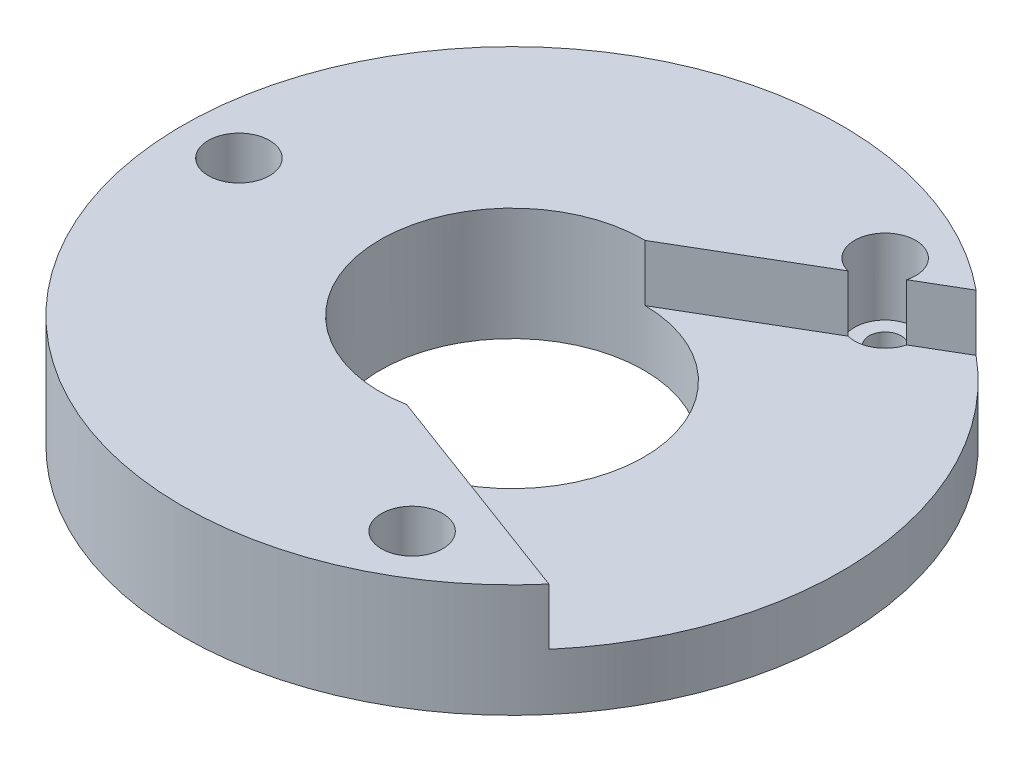
ISO-10303-21;
HEADER;
FILE_DESCRIPTION(('STEP AP214'),'2;1');
FILE_NAME('part.step','',(''),(''),'','','');
FILE_SCHEMA(('AUTOMOTIVE_DESIGN { 1 0 10303 214 1 1 1 1 }'));
ENDSEC;
DATA;
#1=APPLICATION_CONTEXT('core data for automotive mechanical design processes');
#2=APPLICATION_PROTOCOL_DEFINITION('international standard','automotive_design',2000,#1);
#3=PRODUCT_CONTEXT('',#1,'mechanical');
#4=PRODUCT('Part','Part','',(#3));
#5=PRODUCT_RELATED_PRODUCT_CATEGORY('part','',(#4));
#6=PRODUCT_DEFINITION_FORMATION('','',#4);
#7=PRODUCT_DEFINITION_CONTEXT('part definition',#1,'design');
#8=PRODUCT_DEFINITION('design','',#6,#7);
#9=PRODUCT_DEFINITION_SHAPE('','',#8);
#10=(LENGTH_UNIT() NAMED_UNIT(*) SI_UNIT(.MILLI.,.METRE.));
#11=(NAMED_UNIT(*) PLANE_ANGLE_UNIT() SI_UNIT($,.RADIAN.));
#12=(NAMED_UNIT(*) SI_UNIT($,.STERADIAN.) SOLID_ANGLE_UNIT());
#13=UNCERTAINTY_MEASURE_WITH_UNIT(LENGTH_MEASURE(1.E-05),#10,'distance_accuracy_value','');
#14=(GEOMETRIC_REPRESENTATION_CONTEXT(3) GLOBAL_UNCERTAINTY_ASSIGNED_CONTEXT((#13)) GLOBAL_UNIT_ASSIGNED_CONTEXT((#10,
#11,#12)) REPRESENTATION_CONTEXT('',''));
#15=CARTESIAN_POINT('',(0.,0.,0.));
#16=DIRECTION('',(0.,0.,1.));
#17=DIRECTION('',(1.,0.,0.));
#18=AXIS2_PLACEMENT_3D('',#15,#16,#17);
#19=CARTESIAN_POINT('',(14.5,12.,-25.1147367097487));
#20=DIRECTION('',(0.,-1.,0.));
#21=DIRECTION('',(0.,0.,-1.));
#22=AXIS2_PLACEMENT_3D('',#19,#20,#21);
#23=CYLINDRICAL_SURFACE('',#22,1.7);
#24=CARTESIAN_POINT('',(14.5,0.,-25.1147367097487));
#25=DIRECTION('',(0.,1.,0.));
#26=DIRECTION('',(0.,0.,1.));
#27=AXIS2_PLACEMENT_3D('',#24,#25,#26);
#28=CIRCLE('',#27,1.7);
#29=CARTESIAN_POINT('',(14.5,0.,-23.4147367097487));
#30=VERTEX_POINT('',#29);
#31=EDGE_CURVE('E146',#30,#30,#28,.T.);
#32=ORIENTED_EDGE('',*,*,#31,.F.);
#33=EDGE_LOOP('',(#32));
#34=FACE_BOUND('',#33,.T.);
#35=CARTESIAN_POINT('',(14.5,4.,-25.1147367097487));
#36=DIRECTION('',(0.,1.,0.));
#37=DIRECTION('',(0.,0.,1.));
#38=AXIS2_PLACEMENT_3D('',#35,#36,#37);
#39=CIRCLE('',#38,1.7);
#40=CARTESIAN_POINT('',(14.5,4.,-23.4147367097487));
#41=VERTEX_POINT('',#40);
#42=EDGE_CURVE('E53',#41,#41,#39,.T.);
#43=ORIENTED_EDGE('',*,*,#42,.T.);
#44=EDGE_LOOP('',(#43));
#45=FACE_BOUND('',#44,.T.);
#46=ADVANCED_FACE('F49',(#34,#45),#23,.F.);
#47=CARTESIAN_POINT('',(14.5,12.,25.1147367097487));
#48=DIRECTION('',(0.,-1.,0.));
#49=DIRECTION('',(0.,0.,-1.));
#50=AXIS2_PLACEMENT_3D('',#47,#48,#49);
#51=CYLINDRICAL_SURFACE('',#50,1.7);
#52=CARTESIAN_POINT('',(14.5,0.,25.1147367097487));
#53=DIRECTION('',(0.,1.,0.));
#54=DIRECTION('',(0.,0.,1.));
#55=AXIS2_PLACEMENT_3D('',#52,#53,#54);
#56=CIRCLE('',#55,1.7);
#57=CARTESIAN_POINT('',(14.5,0.,26.8147367097487));
#58=VERTEX_POINT('',#57);
#59=EDGE_CURVE('E143',#58,#58,#56,.T.);
#60=ORIENTED_EDGE('',*,*,#59,.F.);
#61=EDGE_LOOP('',(#60));
#62=FACE_BOUND('',#61,.T.);
#63=CARTESIAN_POINT('',(14.5,4.,25.1147367097487));
#64=DIRECTION('',(0.,1.,0.));
#65=DIRECTION('',(0.,0.,1.));
#66=AXIS2_PLACEMENT_3D('',#63,#64,#65);
#67=CIRCLE('',#66,1.7);
#68=CARTESIAN_POINT('',(14.5,4.,26.8147367097487));
#69=VERTEX_POINT('',#68);
#70=EDGE_CURVE('E156',#69,#69,#67,.T.);
#71=ORIENTED_EDGE('',*,*,#70,.T.);
#72=EDGE_LOOP('',(#71));
#73=FACE_BOUND('',#72,.T.);
#74=ADVANCED_FACE('F203',(#62,#73),#51,.F.);
#75=CARTESIAN_POINT('',(-29.,12.,0.));
#76=DIRECTION('',(0.,-1.,0.));
#77=DIRECTION('',(0.,0.,-1.));
#78=AXIS2_PLACEMENT_3D('',#75,#76,#77);
#79=CYLINDRICAL_SURFACE('',#78,1.7);
#80=CARTESIAN_POINT('',(-29.,0.,0.));
#81=DIRECTION('',(0.,1.,0.));
#82=DIRECTION('',(0.,0.,1.));
#83=AXIS2_PLACEMENT_3D('',#80,#81,#82);
#84=CIRCLE('',#83,1.7);
#85=CARTESIAN_POINT('',(-29.,0.,1.69999999999998));
#86=VERTEX_POINT('',#85);
#87=EDGE_CURVE('E136',#86,#86,#84,.T.);
#88=ORIENTED_EDGE('',*,*,#87,.F.);
#89=EDGE_LOOP('',(#88));
#90=FACE_BOUND('',#89,.T.);
#91=CARTESIAN_POINT('',(-29.,4.,0.));
#92=DIRECTION('',(0.,1.,0.));
#93=DIRECTION('',(0.,0.,1.));
#94=AXIS2_PLACEMENT_3D('',#91,#92,#93);
#95=CIRCLE('',#94,1.7);
#96=CARTESIAN_POINT('',(-29.,4.,1.69999999999998));
#97=VERTEX_POINT('',#96);
#98=EDGE_CURVE('E109',#97,#97,#95,.T.);
#99=ORIENTED_EDGE('',*,*,#98,.T.);
#100=EDGE_LOOP('',(#99));
#101=FACE_BOUND('',#100,.T.);
#102=ADVANCED_FACE('F209',(#90,#101),#79,.F.);
#103=CARTESIAN_POINT('',(-6.07447058478018,6.,-10.3489519814636));
#104=DIRECTION('',(0.506205882065015,0.,0.86241266512197));
#105=DIRECTION('',(0.862412665121971,0.,-0.506205882065015));
#106=AXIS2_PLACEMENT_3D('',#103,#104,#105);
#107=PLANE('',#106);
#108=DIRECTION('',(0.,1.,0.));
#109=VECTOR('',#108,1.);
#110=CARTESIAN_POINT('',(17.6375021066938,4.,-24.2670454154133));
#111=LINE('',#110,#109);
#112=CARTESIAN_POINT('',(17.6375021066938,6.,-24.2670454154133));
#113=VERTEX_POINT('',#112);
#114=CARTESIAN_POINT('',(17.6375021066938,12.,-24.2670454154133));
#115=VERTEX_POINT('',#114);
#116=EDGE_CURVE('E101',#113,#115,#111,.T.);
#117=ORIENTED_EDGE('',*,*,#116,.F.);
#118=DIRECTION('',(0.862412665121971,0.,-0.506205882065015));
#119=VECTOR('',#118,1.);
#120=CARTESIAN_POINT('',(-6.07447058478018,6.,-10.3489519814636));
#121=LINE('',#120,#119);
#122=CARTESIAN_POINT('',(22.2804198040886,6.,-26.9922746976533));
#123=VERTEX_POINT('',#122);
#124=EDGE_CURVE('E176',#113,#123,#121,.T.);
#125=ORIENTED_EDGE('',*,*,#124,.T.);
#126=DIRECTION('',(0.,1.,0.));
#127=VECTOR('',#126,1.);
#128=CARTESIAN_POINT('',(22.2804198040886,6.,-26.9922746976533));
#129=LINE('',#128,#127);
#130=CARTESIAN_POINT('',(22.2804198040886,12.,-26.9922746976533));
#131=VERTEX_POINT('',#130);
#132=EDGE_CURVE('E126',#123,#131,#129,.T.);
#133=ORIENTED_EDGE('',*,*,#132,.T.);
#134=DIRECTION('',(0.862412665121971,0.,-0.506205882065015));
#135=VECTOR('',#134,1.);
#136=CARTESIAN_POINT('',(-6.07447058478018,12.,-10.3489519814636));
#137=LINE('',#136,#135);
#138=EDGE_CURVE('E116',#115,#131,#137,.T.);
#139=ORIENTED_EDGE('',*,*,#138,.F.);
#140=EDGE_LOOP('',(#117,#125,#133,#139));
#141=FACE_BOUND('',#140,.T.);
#142=ADVANCED_FACE('F124',(#141),#107,.T.);
#143=CARTESIAN_POINT('',(0.,12.,0.));
#144=DIRECTION('',(0.,1.,0.));
#145=DIRECTION('',(0.,0.,1.));
#146=AXIS2_PLACEMENT_3D('',#143,#144,#145);
#147=PLANE('',#146);
#148=CARTESIAN_POINT('',(14.5,12.,-25.1147367097487));
#149=DIRECTION('',(0.,1.,0.));
#150=DIRECTION('',(0.,0.,1.));
#151=AXIS2_PLACEMENT_3D('',#148,#149,#150);
#152=CIRCLE('',#151,3.25);
#153=CARTESIAN_POINT('',(13.7105660008352,12.,-21.9620721286423));
#154=VERTEX_POINT('',#153);
#155=EDGE_CURVE('E105',#115,#154,#152,.T.);
#156=ORIENTED_EDGE('',*,*,#155,.F.);
#157=ORIENTED_EDGE('',*,*,#138,.T.);
#158=CARTESIAN_POINT('',(0.,12.,0.));
#159=DIRECTION('',(0.,1.,0.));
#160=DIRECTION('',(0.,0.,1.));
#161=AXIS2_PLACEMENT_3D('',#158,#159,#160);
#162=CIRCLE('',#161,35.);
#163=CARTESIAN_POINT('',(26.6290894757659,12.,22.7132470970501));
#164=VERTEX_POINT('',#163);
#165=EDGE_CURVE('E150',#131,#164,#162,.T.);
#166=ORIENTED_EDGE('',*,*,#165,.T.);
#167=DIRECTION('',(0.937212407852909,0.,0.348759089582699));
#168=VECTOR('',#167,1.);
#169=CARTESIAN_POINT('',(-4.18510907499239,12.,11.2465488942349));
#170=LINE('',#169,#168);
#171=CARTESIAN_POINT('',(2.57322571003706,12.,13.761486454784));
#172=VERTEX_POINT('',#171);
#173=EDGE_CURVE('E128',#172,#164,#170,.T.);
#174=ORIENTED_EDGE('',*,*,#173,.F.);
#175=CARTESIAN_POINT('',(0.,12.,0.));
#176=DIRECTION('',(0.,-1.,0.));
#177=DIRECTION('',(0.,0.,-1.));
#178=AXIS2_PLACEMENT_3D('',#175,#176,#177);
#179=CIRCLE('',#178,14.);
#180=CARTESIAN_POINT('',(0.144475584633452,12.,-13.9992545089174));
#181=VERTEX_POINT('',#180);
#182=EDGE_CURVE('E165',#172,#181,#179,.T.);
#183=ORIENTED_EDGE('',*,*,#182,.T.);
#184=EDGE_CURVE('E120',#181,#154,#137,.T.);
#185=ORIENTED_EDGE('',*,*,#184,.T.);
#186=EDGE_LOOP('',(#156,#157,#166,#174,#183,#185));
#187=FACE_BOUND('',#186,.T.);
#188=CARTESIAN_POINT('',(14.5,12.,25.1147367097487));
#189=DIRECTION('',(0.,1.,0.));
#190=DIRECTION('',(0.,0.,1.));
#191=AXIS2_PLACEMENT_3D('',#188,#189,#190);
#192=CIRCLE('',#191,3.25);
#193=CARTESIAN_POINT('',(14.5,12.,28.3647367097487));
#194=VERTEX_POINT('',#193);
#195=EDGE_CURVE('E243',#194,#194,#192,.T.);
#196=ORIENTED_EDGE('',*,*,#195,.F.);
#197=EDGE_LOOP('',(#196));
#198=FACE_BOUND('',#197,.T.);
#199=CARTESIAN_POINT('',(-29.,12.,0.));
#200=DIRECTION('',(0.,1.,0.));
#201=DIRECTION('',(0.,0.,1.));
#202=AXIS2_PLACEMENT_3D('',#199,#200,#201);
#203=CIRCLE('',#202,3.25);
#204=CARTESIAN_POINT('',(-29.,12.,3.24999999999998));
#205=VERTEX_POINT('',#204);
#206=EDGE_CURVE('E244',#205,#205,#203,.T.);
#207=ORIENTED_EDGE('',*,*,#206,.F.);
#208=EDGE_LOOP('',(#207));
#209=FACE_BOUND('',#208,.T.);
#210=ADVANCED_FACE('F113',(#187,#198,#209),#147,.T.);
#211=CARTESIAN_POINT('',(0.,12.,0.));
#212=DIRECTION('',(0.,-1.,0.));
#213=DIRECTION('',(0.,0.,-1.));
#214=AXIS2_PLACEMENT_3D('',#211,#212,#213);
#215=CYLINDRICAL_SURFACE('',#214,35.);
#216=CARTESIAN_POINT('',(0.,0.,0.));
#217=DIRECTION('',(0.,1.,0.));
#218=DIRECTION('',(0.,0.,1.));
#219=AXIS2_PLACEMENT_3D('',#216,#217,#218);
#220=CIRCLE('',#219,35.);
#221=CARTESIAN_POINT('',(0.,0.,35.));
#222=VERTEX_POINT('',#221);
#223=EDGE_CURVE('E149',#222,#222,#220,.T.);
#224=ORIENTED_EDGE('',*,*,#223,.T.);
#225=EDGE_LOOP('',(#224));
#226=FACE_BOUND('',#225,.T.);
#227=ORIENTED_EDGE('',*,*,#132,.F.);
#228=CARTESIAN_POINT('',(0.,6.,0.));
#229=DIRECTION('',(0.,1.,0.));
#230=DIRECTION('',(0.,0.,1.));
#231=AXIS2_PLACEMENT_3D('',#228,#229,#230);
#232=CIRCLE('',#231,35.);
#233=CARTESIAN_POINT('',(26.6290894757659,6.,22.7132470970501));
#234=VERTEX_POINT('',#233);
#235=EDGE_CURVE('E174',#234,#123,#232,.T.);
#236=ORIENTED_EDGE('',*,*,#235,.F.);
#237=DIRECTION('',(0.,1.,0.));
#238=VECTOR('',#237,1.);
#239=CARTESIAN_POINT('',(26.6290894757659,6.,22.7132470970501));
#240=LINE('',#239,#238);
#241=EDGE_CURVE('E137',#234,#164,#240,.T.);
#242=ORIENTED_EDGE('',*,*,#241,.T.);
#243=ORIENTED_EDGE('',*,*,#165,.F.);
#244=EDGE_LOOP('',(#227,#236,#242,#243));
#245=FACE_BOUND('',#244,.T.);
#246=ADVANCED_FACE('F51',(#226,#245),#215,.T.);
#247=CARTESIAN_POINT('',(0.,0.,0.));
#248=DIRECTION('',(0.,1.,0.));
#249=DIRECTION('',(0.,0.,1.));
#250=AXIS2_PLACEMENT_3D('',#247,#248,#249);
#251=PLANE('',#250);
#252=CARTESIAN_POINT('',(0.,0.,0.));
#253=DIRECTION('',(0.,-1.,0.));
#254=DIRECTION('',(0.,0.,-1.));
#255=AXIS2_PLACEMENT_3D('',#252,#253,#254);
#256=CIRCLE('',#255,14.);
#257=CARTESIAN_POINT('',(0.,0.,-14.));
#258=VERTEX_POINT('',#257);
#259=EDGE_CURVE('E161',#258,#258,#256,.T.);
#260=ORIENTED_EDGE('',*,*,#259,.F.);
#261=EDGE_LOOP('',(#260));
#262=FACE_BOUND('',#261,.T.);
#263=ORIENTED_EDGE('',*,*,#223,.F.);
#264=EDGE_LOOP('',(#263));
#265=FACE_BOUND('',#264,.T.);
#266=ORIENTED_EDGE('',*,*,#31,.T.);
#267=EDGE_LOOP('',(#266));
#268=FACE_BOUND('',#267,.T.);
#269=ORIENTED_EDGE('',*,*,#59,.T.);
#270=EDGE_LOOP('',(#269));
#271=FACE_BOUND('',#270,.T.);
#272=ORIENTED_EDGE('',*,*,#87,.T.);
#273=EDGE_LOOP('',(#272));
#274=FACE_BOUND('',#273,.T.);
#275=ADVANCED_FACE('F199',(#262,#265,#268,#271,#274),#251,.F.);
#276=DIRECTION('',(0.,1.,0.));
#277=VECTOR('',#276,1.);
#278=CARTESIAN_POINT('',(13.7105660008352,4.,-21.9620721286423));
#279=LINE('',#278,#277);
#280=CARTESIAN_POINT('',(13.7105660008352,6.,-21.9620721286423));
#281=VERTEX_POINT('',#280);
#282=EDGE_CURVE('E65',#154,#281,#279,.F.);
#283=ORIENTED_EDGE('',*,*,#282,.F.);
#284=ORIENTED_EDGE('',*,*,#184,.F.);
#285=DIRECTION('',(0.,-1.,0.));
#286=VECTOR('',#285,1.);
#287=CARTESIAN_POINT('',(0.14447558463346,12.,-13.9992545089174));
#288=LINE('',#287,#286);
#289=CARTESIAN_POINT('',(0.144475584633452,6.,-13.9992545089174));
#290=VERTEX_POINT('',#289);
#291=EDGE_CURVE('E131',#290,#181,#288,.F.);
#292=ORIENTED_EDGE('',*,*,#291,.F.);
#293=EDGE_CURVE('E140',#290,#281,#121,.T.);
#294=ORIENTED_EDGE('',*,*,#293,.T.);
#295=EDGE_LOOP('',(#283,#284,#292,#294));
#296=FACE_BOUND('',#295,.T.);
#297=ADVANCED_FACE('F191',(#296),#107,.T.);
#298=CARTESIAN_POINT('',(-4.18510907499239,6.,11.2465488942349));
#299=DIRECTION('',(-0.348759089582699,0.,0.937212407852909));
#300=DIRECTION('',(0.937212407852909,0.,0.348759089582699));
#301=AXIS2_PLACEMENT_3D('',#298,#299,#300);
#302=PLANE('',#301);
#303=DIRECTION('',(0.937212407852909,0.,0.348759089582699));
#304=VECTOR('',#303,1.);
#305=CARTESIAN_POINT('',(-4.18510907499239,6.,11.2465488942349));
#306=LINE('',#305,#304);
#307=CARTESIAN_POINT('',(2.57322571003706,6.,13.761486454784));
#308=VERTEX_POINT('',#307);
#309=EDGE_CURVE('E130',#308,#234,#306,.T.);
#310=ORIENTED_EDGE('',*,*,#309,.F.);
#311=DIRECTION('',(0.,-1.,0.));
#312=VECTOR('',#311,1.);
#313=CARTESIAN_POINT('',(2.57322571003707,12.,13.761486454784));
#314=LINE('',#313,#312);
#315=EDGE_CURVE('E73',#308,#172,#314,.F.);
#316=ORIENTED_EDGE('',*,*,#315,.T.);
#317=ORIENTED_EDGE('',*,*,#173,.T.);
#318=ORIENTED_EDGE('',*,*,#241,.F.);
#319=EDGE_LOOP('',(#310,#316,#317,#318));
#320=FACE_BOUND('',#319,.T.);
#321=ADVANCED_FACE('F189',(#320),#302,.F.);
#322=CARTESIAN_POINT('',(0.,6.,0.));
#323=DIRECTION('',(0.,1.,0.));
#324=DIRECTION('',(0.,0.,1.));
#325=AXIS2_PLACEMENT_3D('',#322,#323,#324);
#326=PLANE('',#325);
#327=CARTESIAN_POINT('',(14.5,6.,-25.1147367097487));
#328=DIRECTION('',(0.,1.,0.));
#329=DIRECTION('',(0.,0.,1.));
#330=AXIS2_PLACEMENT_3D('',#327,#328,#329);
#331=CIRCLE('',#330,3.25);
#332=EDGE_CURVE('E12',#281,#113,#331,.T.);
#333=ORIENTED_EDGE('',*,*,#332,.F.);
#334=ORIENTED_EDGE('',*,*,#293,.F.);
#335=CARTESIAN_POINT('',(0.,6.,0.));
#336=DIRECTION('',(0.,1.,0.));
#337=DIRECTION('',(0.,0.,1.));
#338=AXIS2_PLACEMENT_3D('',#335,#336,#337);
#339=CIRCLE('',#338,14.);
#340=EDGE_CURVE('E58',#308,#290,#339,.T.);
#341=ORIENTED_EDGE('',*,*,#340,.F.);
#342=ORIENTED_EDGE('',*,*,#309,.T.);
#343=ORIENTED_EDGE('',*,*,#235,.T.);
#344=ORIENTED_EDGE('',*,*,#124,.F.);
#345=EDGE_LOOP('',(#333,#334,#341,#342,#343,#344));
#346=FACE_BOUND('',#345,.T.);
#347=ADVANCED_FACE('F183',(#346),#326,.T.);
#348=CARTESIAN_POINT('',(0.,12.,0.));
#349=DIRECTION('',(0.,-1.,0.));
#350=DIRECTION('',(0.,0.,-1.));
#351=AXIS2_PLACEMENT_3D('',#348,#349,#350);
#352=CYLINDRICAL_SURFACE('',#351,14.);
#353=ORIENTED_EDGE('',*,*,#291,.T.);
#354=ORIENTED_EDGE('',*,*,#182,.F.);
#355=ORIENTED_EDGE('',*,*,#315,.F.);
#356=ORIENTED_EDGE('',*,*,#340,.T.);
#357=EDGE_LOOP('',(#353,#354,#355,#356));
#358=FACE_BOUND('',#357,.T.);
#359=ORIENTED_EDGE('',*,*,#259,.T.);
#360=EDGE_LOOP('',(#359));
#361=FACE_BOUND('',#360,.T.);
#362=ADVANCED_FACE('F197',(#358,#361),#352,.F.);
#363=CARTESIAN_POINT('',(14.5,4.,-25.1147367097487));
#364=DIRECTION('',(0.,1.,0.));
#365=DIRECTION('',(0.,0.,1.));
#366=AXIS2_PLACEMENT_3D('',#363,#364,#365);
#367=CYLINDRICAL_SURFACE('',#366,3.25);
#368=ORIENTED_EDGE('',*,*,#116,.T.);
#369=ORIENTED_EDGE('',*,*,#155,.T.);
#370=ORIENTED_EDGE('',*,*,#282,.T.);
#371=ORIENTED_EDGE('',*,*,#332,.T.);
#372=EDGE_LOOP('',(#368,#369,#370,#371));
#373=FACE_BOUND('',#372,.T.);
#374=CARTESIAN_POINT('',(14.5,4.,-25.1147367097487));
#375=DIRECTION('',(0.,1.,0.));
#376=DIRECTION('',(0.,0.,1.));
#377=AXIS2_PLACEMENT_3D('',#374,#375,#376);
#378=CIRCLE('',#377,3.25);
#379=CARTESIAN_POINT('',(14.5,4.,-21.8647367097487));
#380=VERTEX_POINT('',#379);
#381=EDGE_CURVE('E121',#380,#380,#378,.T.);
#382=ORIENTED_EDGE('',*,*,#381,.F.);
#383=EDGE_LOOP('',(#382));
#384=FACE_BOUND('',#383,.T.);
#385=ADVANCED_FACE('F103',(#373,#384),#367,.F.);
#386=CARTESIAN_POINT('',(14.5,4.,-25.1147367097487));
#387=DIRECTION('',(0.,1.,0.));
#388=DIRECTION('',(0.,0.,1.));
#389=AXIS2_PLACEMENT_3D('',#386,#387,#388);
#390=PLANE('',#389);
#391=ORIENTED_EDGE('',*,*,#42,.F.);
#392=EDGE_LOOP('',(#391));
#393=FACE_BOUND('',#392,.T.);
#394=ORIENTED_EDGE('',*,*,#381,.T.);
#395=EDGE_LOOP('',(#394));
#396=FACE_BOUND('',#395,.T.);
#397=ADVANCED_FACE('F269',(#393,#396),#390,.T.);
#398=CARTESIAN_POINT('',(-29.,4.,0.));
#399=DIRECTION('',(0.,1.,0.));
#400=DIRECTION('',(0.,0.,1.));
#401=AXIS2_PLACEMENT_3D('',#398,#399,#400);
#402=CYLINDRICAL_SURFACE('',#401,3.25);
#403=CARTESIAN_POINT('',(-29.,4.,0.));
#404=DIRECTION('',(0.,1.,0.));
#405=DIRECTION('',(0.,0.,1.));
#406=AXIS2_PLACEMENT_3D('',#403,#404,#405);
#407=CIRCLE('',#406,3.25);
#408=CARTESIAN_POINT('',(-29.,4.,3.24999999999998));
#409=VERTEX_POINT('',#408);
#410=EDGE_CURVE('E241',#409,#409,#407,.T.);
#411=ORIENTED_EDGE('',*,*,#410,.F.);
#412=EDGE_LOOP('',(#411));
#413=FACE_BOUND('',#412,.T.);
#414=ORIENTED_EDGE('',*,*,#206,.T.);
#415=EDGE_LOOP('',(#414));
#416=FACE_BOUND('',#415,.T.);
#417=ADVANCED_FACE('F237',(#413,#416),#402,.F.);
#418=CARTESIAN_POINT('',(-29.,4.,0.));
#419=DIRECTION('',(0.,1.,0.));
#420=DIRECTION('',(0.,0.,1.));
#421=AXIS2_PLACEMENT_3D('',#418,#419,#420);
#422=PLANE('',#421);
#423=ORIENTED_EDGE('',*,*,#98,.F.);
#424=EDGE_LOOP('',(#423));
#425=FACE_BOUND('',#424,.T.);
#426=ORIENTED_EDGE('',*,*,#410,.T.);
#427=EDGE_LOOP('',(#426));
#428=FACE_BOUND('',#427,.T.);
#429=ADVANCED_FACE('F233',(#425,#428),#422,.T.);
#430=CARTESIAN_POINT('',(14.5,4.,25.1147367097487));
#431=DIRECTION('',(0.,1.,0.));
#432=DIRECTION('',(0.,0.,1.));
#433=AXIS2_PLACEMENT_3D('',#430,#431,#432);
#434=CYLINDRICAL_SURFACE('',#433,3.25);
#435=CARTESIAN_POINT('',(14.5,4.,25.1147367097487));
#436=DIRECTION('',(0.,1.,0.));
#437=DIRECTION('',(0.,0.,1.));
#438=AXIS2_PLACEMENT_3D('',#435,#436,#437);
#439=CIRCLE('',#438,3.25);
#440=CARTESIAN_POINT('',(14.5,4.,28.3647367097487));
#441=VERTEX_POINT('',#440);
#442=EDGE_CURVE('E122',#441,#441,#439,.T.);
#443=ORIENTED_EDGE('',*,*,#442,.F.);
#444=EDGE_LOOP('',(#443));
#445=FACE_BOUND('',#444,.T.);
#446=ORIENTED_EDGE('',*,*,#195,.T.);
#447=EDGE_LOOP('',(#446));
#448=FACE_BOUND('',#447,.T.);
#449=ADVANCED_FACE('F236',(#445,#448),#434,.F.);
#450=CARTESIAN_POINT('',(14.5,4.,25.1147367097487));
#451=DIRECTION('',(0.,1.,0.));
#452=DIRECTION('',(0.,0.,1.));
#453=AXIS2_PLACEMENT_3D('',#450,#451,#452);
#454=PLANE('',#453);
#455=ORIENTED_EDGE('',*,*,#70,.F.);
#456=EDGE_LOOP('',(#455));
#457=FACE_BOUND('',#456,.T.);
#458=ORIENTED_EDGE('',*,*,#442,.T.);
#459=EDGE_LOOP('',(#458));
#460=FACE_BOUND('',#459,.T.);
#461=ADVANCED_FACE('F259',(#457,#460),#454,.T.);
#462=CLOSED_SHELL('',(#46,#74,#102,#142,#210,#246,#275,#297,#321,#347,#362,#385,#397,#417,#429,
#449,#461));
#463=MANIFOLD_SOLID_BREP('B2',#462);
#464=ADVANCED_BREP_SHAPE_REPRESENTATION('',(#18,#463),#14);
#465=SHAPE_DEFINITION_REPRESENTATION(#9,#464);
ENDSEC;
END-ISO-10303-21;
